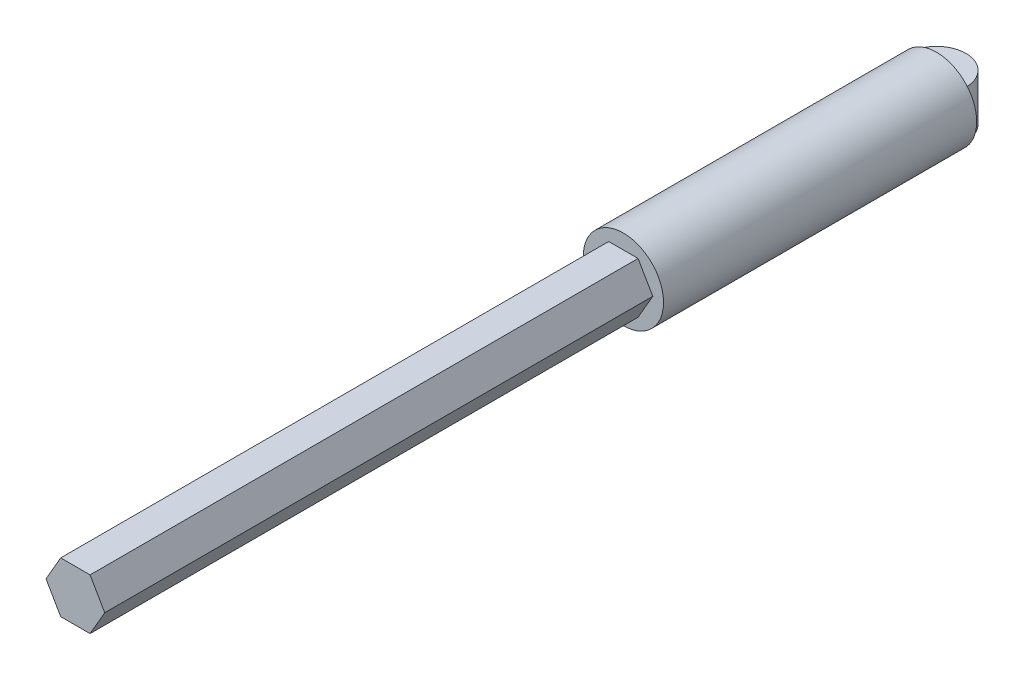
ISO-10303-21;
HEADER;
FILE_DESCRIPTION(('STEP AP214'),'2;1');
FILE_NAME('part.step','',(''),(''),'','','');
FILE_SCHEMA(('AUTOMOTIVE_DESIGN { 1 0 10303 214 1 1 1 1 }'));
ENDSEC;
DATA;
#1=APPLICATION_CONTEXT('core data for automotive mechanical design processes');
#2=APPLICATION_PROTOCOL_DEFINITION('international standard','automotive_design',2000,#1);
#3=PRODUCT_CONTEXT('',#1,'mechanical');
#4=PRODUCT('Part','Part','',(#3));
#5=PRODUCT_RELATED_PRODUCT_CATEGORY('part','',(#4));
#6=PRODUCT_DEFINITION_FORMATION('','',#4);
#7=PRODUCT_DEFINITION_CONTEXT('part definition',#1,'design');
#8=PRODUCT_DEFINITION('design','',#6,#7);
#9=PRODUCT_DEFINITION_SHAPE('','',#8);
#10=(LENGTH_UNIT() NAMED_UNIT(*) SI_UNIT(.MILLI.,.METRE.));
#11=(NAMED_UNIT(*) PLANE_ANGLE_UNIT() SI_UNIT($,.RADIAN.));
#12=(NAMED_UNIT(*) SI_UNIT($,.STERADIAN.) SOLID_ANGLE_UNIT());
#13=UNCERTAINTY_MEASURE_WITH_UNIT(LENGTH_MEASURE(1.E-05),#10,'distance_accuracy_value','');
#14=(GEOMETRIC_REPRESENTATION_CONTEXT(3) GLOBAL_UNCERTAINTY_ASSIGNED_CONTEXT((#13)) GLOBAL_UNIT_ASSIGNED_CONTEXT((#10,
#11,#12)) REPRESENTATION_CONTEXT('',''));
#15=CARTESIAN_POINT('',(0.,0.,0.));
#16=DIRECTION('',(0.,0.,1.));
#17=DIRECTION('',(1.,0.,0.));
#18=AXIS2_PLACEMENT_3D('',#15,#16,#17);
#19=CARTESIAN_POINT('',(0.,0.,0.));
#20=DIRECTION('',(0.,0.,1.));
#21=DIRECTION('',(1.,0.,0.));
#22=AXIS2_PLACEMENT_3D('',#19,#20,#21);
#23=PLANE('',#22);
#24=CARTESIAN_POINT('',(0.,0.,0.));
#25=DIRECTION('',(0.,0.,1.));
#26=DIRECTION('',(1.,0.,0.));
#27=AXIS2_PLACEMENT_3D('',#24,#25,#26);
#28=CIRCLE('',#27,1.025);
#29=CARTESIAN_POINT('',(1.025,0.,0.));
#30=VERTEX_POINT('',#29);
#31=EDGE_CURVE('E54',#30,#30,#28,.T.);
#32=ORIENTED_EDGE('',*,*,#31,.F.);
#33=EDGE_LOOP('',(#32));
#34=FACE_BOUND('',#33,.T.);
#35=DIRECTION('',(-1.,0.,0.));
#36=VECTOR('',#35,1.);
#37=CARTESIAN_POINT('',(0.,-0.575,0.));
#38=LINE('',#37,#36);
#39=CARTESIAN_POINT('',(0.75,-0.575,0.));
#40=VERTEX_POINT('',#39);
#41=CARTESIAN_POINT('',(-0.75,-0.575,0.));
#42=VERTEX_POINT('',#41);
#43=EDGE_CURVE('E120',#40,#42,#38,.T.);
#44=ORIENTED_EDGE('',*,*,#43,.F.);
#45=DIRECTION('',(0.,1.,0.));
#46=VECTOR('',#45,1.);
#47=CARTESIAN_POINT('',(0.75,-0.2,0.));
#48=LINE('',#47,#46);
#49=CARTESIAN_POINT('',(0.75,0.625,0.));
#50=VERTEX_POINT('',#49);
#51=EDGE_CURVE('E205',#40,#50,#48,.T.);
#52=ORIENTED_EDGE('',*,*,#51,.T.);
#53=DIRECTION('',(1.,0.,0.));
#54=VECTOR('',#53,1.);
#55=CARTESIAN_POINT('',(0.,0.625,0.));
#56=LINE('',#55,#54);
#57=CARTESIAN_POINT('',(-0.75,0.625,0.));
#58=VERTEX_POINT('',#57);
#59=EDGE_CURVE('E197',#58,#50,#56,.T.);
#60=ORIENTED_EDGE('',*,*,#59,.F.);
#61=DIRECTION('',(0.,1.,0.));
#62=VECTOR('',#61,1.);
#63=CARTESIAN_POINT('',(-0.75,-0.2,0.));
#64=LINE('',#63,#62);
#65=EDGE_CURVE('E68',#42,#58,#64,.T.);
#66=ORIENTED_EDGE('',*,*,#65,.F.);
#67=EDGE_LOOP('',(#44,#52,#60,#66));
#68=FACE_BOUND('',#67,.T.);
#69=ADVANCED_FACE('F45',(#34,#68),#23,.F.);
#70=CARTESIAN_POINT('',(0.,0.,5.));
#71=DIRECTION('',(0.,0.,-1.));
#72=DIRECTION('',(-1.,0.,0.));
#73=AXIS2_PLACEMENT_3D('',#70,#71,#72);
#74=CYLINDRICAL_SURFACE('',#73,1.025);
#75=ORIENTED_EDGE('',*,*,#31,.T.);
#76=EDGE_LOOP('',(#75));
#77=FACE_BOUND('',#76,.T.);
#78=CARTESIAN_POINT('',(0.,0.,8.));
#79=DIRECTION('',(0.,0.,1.));
#80=DIRECTION('',(1.,0.,0.));
#81=AXIS2_PLACEMENT_3D('',#78,#79,#80);
#82=CIRCLE('',#81,1.025);
#83=CARTESIAN_POINT('',(1.025,0.,8.));
#84=VERTEX_POINT('',#83);
#85=EDGE_CURVE('E152',#84,#84,#82,.T.);
#86=ORIENTED_EDGE('',*,*,#85,.F.);
#87=EDGE_LOOP('',(#86));
#88=FACE_BOUND('',#87,.T.);
#89=ADVANCED_FACE('F47',(#77,#88),#74,.T.);
#90=CARTESIAN_POINT('',(0.,-0.2,0.));
#91=DIRECTION('',(0.,1.,0.));
#92=DIRECTION('',(0.,0.,1.));
#93=AXIS2_PLACEMENT_3D('',#90,#91,#92);
#94=CYLINDRICAL_SURFACE('',#93,0.75);
#95=ORIENTED_EDGE('',*,*,#65,.T.);
#96=CARTESIAN_POINT('',(0.,0.625,0.));
#97=DIRECTION('',(0.,1.,0.));
#98=DIRECTION('',(0.,0.,1.));
#99=AXIS2_PLACEMENT_3D('',#96,#97,#98);
#100=CIRCLE('',#99,0.75);
#101=EDGE_CURVE('E201',#50,#58,#100,.T.);
#102=ORIENTED_EDGE('',*,*,#101,.F.);
#103=ORIENTED_EDGE('',*,*,#51,.F.);
#104=CARTESIAN_POINT('',(0.,-0.575,0.));
#105=DIRECTION('',(0.,-1.,0.));
#106=DIRECTION('',(0.,0.,-1.));
#107=AXIS2_PLACEMENT_3D('',#104,#105,#106);
#108=CIRCLE('',#107,0.75);
#109=EDGE_CURVE('E193',#42,#40,#108,.T.);
#110=ORIENTED_EDGE('',*,*,#109,.F.);
#111=EDGE_LOOP('',(#95,#102,#103,#110));
#112=FACE_BOUND('',#111,.T.);
#113=ADVANCED_FACE('F220',(#112),#94,.T.);
#114=CARTESIAN_POINT('',(0.,0.625,0.));
#115=DIRECTION('',(0.,1.,0.));
#116=DIRECTION('',(0.,0.,1.));
#117=AXIS2_PLACEMENT_3D('',#114,#115,#116);
#118=PLANE('',#117);
#119=ORIENTED_EDGE('',*,*,#59,.T.);
#120=ORIENTED_EDGE('',*,*,#101,.T.);
#121=EDGE_LOOP('',(#119,#120));
#122=FACE_BOUND('',#121,.T.);
#123=ADVANCED_FACE('F222',(#122),#118,.T.);
#124=CARTESIAN_POINT('',(0.,-0.575,0.));
#125=DIRECTION('',(0.,-1.,0.));
#126=DIRECTION('',(0.,0.,-1.));
#127=AXIS2_PLACEMENT_3D('',#124,#125,#126);
#128=PLANE('',#127);
#129=ORIENTED_EDGE('',*,*,#43,.T.);
#130=ORIENTED_EDGE('',*,*,#109,.T.);
#131=EDGE_LOOP('',(#129,#130));
#132=FACE_BOUND('',#131,.T.);
#133=ADVANCED_FACE('F219',(#132),#128,.T.);
#134=CARTESIAN_POINT('',(0.,0.,8.));
#135=DIRECTION('',(0.,0.,1.));
#136=DIRECTION('',(1.,0.,0.));
#137=AXIS2_PLACEMENT_3D('',#134,#135,#136);
#138=PLANE('',#137);
#139=ORIENTED_EDGE('',*,*,#85,.T.);
#140=EDGE_LOOP('',(#139));
#141=FACE_BOUND('',#140,.T.);
#142=DIRECTION('',(0.5,0.866025403784439,0.));
#143=VECTOR('',#142,1.);
#144=CARTESIAN_POINT('',(0.562916512459886,-0.325,8.));
#145=LINE('',#144,#143);
#146=CARTESIAN_POINT('',(0.375277674973257,-0.650000000000001,8.));
#147=VERTEX_POINT('',#146);
#148=CARTESIAN_POINT('',(0.750555349946514,0.,8.));
#149=VERTEX_POINT('',#148);
#150=EDGE_CURVE('E61',#147,#149,#145,.T.);
#151=ORIENTED_EDGE('',*,*,#150,.F.);
#152=DIRECTION('',(1.,0.,0.));
#153=VECTOR('',#152,1.);
#154=CARTESIAN_POINT('',(0.,-0.650000000000001,8.));
#155=LINE('',#154,#153);
#156=CARTESIAN_POINT('',(-0.375277674973257,-0.650000000000001,8.));
#157=VERTEX_POINT('',#156);
#158=EDGE_CURVE('E11',#157,#147,#155,.T.);
#159=ORIENTED_EDGE('',*,*,#158,.F.);
#160=DIRECTION('',(0.5,-0.866025403784439,0.));
#161=VECTOR('',#160,1.);
#162=CARTESIAN_POINT('',(-0.562916512459886,-0.325,8.));
#163=LINE('',#162,#161);
#164=CARTESIAN_POINT('',(-0.750555349946514,0.,8.));
#165=VERTEX_POINT('',#164);
#166=EDGE_CURVE('E156',#165,#157,#163,.T.);
#167=ORIENTED_EDGE('',*,*,#166,.F.);
#168=DIRECTION('',(-0.5,-0.866025403784439,0.));
#169=VECTOR('',#168,1.);
#170=CARTESIAN_POINT('',(-0.562916512459886,0.325,8.));
#171=LINE('',#170,#169);
#172=CARTESIAN_POINT('',(-0.375277674973257,0.650000000000001,8.));
#173=VERTEX_POINT('',#172);
#174=EDGE_CURVE('E160',#173,#165,#171,.T.);
#175=ORIENTED_EDGE('',*,*,#174,.F.);
#176=DIRECTION('',(-1.,0.,0.));
#177=VECTOR('',#176,1.);
#178=CARTESIAN_POINT('',(0.,0.650000000000001,8.));
#179=LINE('',#178,#177);
#180=CARTESIAN_POINT('',(0.375277674973257,0.650000000000001,8.));
#181=VERTEX_POINT('',#180);
#182=EDGE_CURVE('E164',#181,#173,#179,.T.);
#183=ORIENTED_EDGE('',*,*,#182,.F.);
#184=DIRECTION('',(-0.5,0.866025403784439,0.));
#185=VECTOR('',#184,1.);
#186=CARTESIAN_POINT('',(0.562916512459885,0.325,8.));
#187=LINE('',#186,#185);
#188=EDGE_CURVE('E168',#149,#181,#187,.T.);
#189=ORIENTED_EDGE('',*,*,#188,.F.);
#190=EDGE_LOOP('',(#151,#159,#167,#175,#183,#189));
#191=FACE_BOUND('',#190,.T.);
#192=ADVANCED_FACE('F229',(#141,#191),#138,.T.);
#193=CARTESIAN_POINT('',(0.,-0.650000000000001,19.));
#194=DIRECTION('',(0.,1.,0.));
#195=DIRECTION('',(0.,0.,1.));
#196=AXIS2_PLACEMENT_3D('',#193,#194,#195);
#197=PLANE('',#196);
#198=DIRECTION('',(0.,0.,-1.));
#199=VECTOR('',#198,1.);
#200=CARTESIAN_POINT('',(-0.375277674973257,-0.650000000000001,19.));
#201=LINE('',#200,#199);
#202=CARTESIAN_POINT('',(-0.375277674973251,-0.650000000000004,22.));
#203=VERTEX_POINT('',#202);
#204=EDGE_CURVE('E176',#203,#157,#201,.T.);
#205=ORIENTED_EDGE('',*,*,#204,.T.);
#206=ORIENTED_EDGE('',*,*,#158,.T.);
#207=DIRECTION('',(0.,0.,-1.));
#208=VECTOR('',#207,1.);
#209=CARTESIAN_POINT('',(0.375277674973257,-0.650000000000001,19.));
#210=LINE('',#209,#208);
#211=CARTESIAN_POINT('',(0.375277674973264,-0.649999999999996,22.));
#212=VERTEX_POINT('',#211);
#213=EDGE_CURVE('E173',#212,#147,#210,.T.);
#214=ORIENTED_EDGE('',*,*,#213,.F.);
#215=DIRECTION('',(1.,0.,0.));
#216=VECTOR('',#215,1.);
#217=CARTESIAN_POINT('',(-0.375277674973251,-0.650000000000004,22.));
#218=LINE('',#217,#216);
#219=EDGE_CURVE('E137',#203,#212,#218,.T.);
#220=ORIENTED_EDGE('',*,*,#219,.F.);
#221=EDGE_LOOP('',(#205,#206,#214,#220));
#222=FACE_BOUND('',#221,.T.);
#223=ADVANCED_FACE('F248',(#222),#197,.F.);
#224=CARTESIAN_POINT('',(-0.562916512459886,-0.325,19.));
#225=DIRECTION('',(0.866025403784439,0.5,0.));
#226=DIRECTION('',(-0.5,0.866025403784439,0.));
#227=AXIS2_PLACEMENT_3D('',#224,#225,#226);
#228=PLANE('',#227);
#229=DIRECTION('',(0.,0.,-1.));
#230=VECTOR('',#229,1.);
#231=CARTESIAN_POINT('',(-0.750555349946514,0.,19.));
#232=LINE('',#231,#230);
#233=CARTESIAN_POINT('',(-0.750555349946514,0.,22.));
#234=VERTEX_POINT('',#233);
#235=EDGE_CURVE('E180',#234,#165,#232,.T.);
#236=ORIENTED_EDGE('',*,*,#235,.T.);
#237=ORIENTED_EDGE('',*,*,#166,.T.);
#238=ORIENTED_EDGE('',*,*,#204,.F.);
#239=DIRECTION('',(0.500000000000007,-0.866025403784435,0.));
#240=VECTOR('',#239,1.);
#241=CARTESIAN_POINT('',(-0.750555349946514,0.,22.));
#242=LINE('',#241,#240);
#243=EDGE_CURVE('E147',#234,#203,#242,.T.);
#244=ORIENTED_EDGE('',*,*,#243,.F.);
#245=EDGE_LOOP('',(#236,#237,#238,#244));
#246=FACE_BOUND('',#245,.T.);
#247=ADVANCED_FACE('F244',(#246),#228,.F.);
#248=CARTESIAN_POINT('',(-0.562916512459886,0.325,19.));
#249=DIRECTION('',(0.866025403784439,-0.5,0.));
#250=DIRECTION('',(0.5,0.866025403784439,0.));
#251=AXIS2_PLACEMENT_3D('',#248,#249,#250);
#252=PLANE('',#251);
#253=DIRECTION('',(0.,0.,-1.));
#254=VECTOR('',#253,1.);
#255=CARTESIAN_POINT('',(-0.375277674973257,0.650000000000001,19.));
#256=LINE('',#255,#254);
#257=CARTESIAN_POINT('',(-0.37527767497326,0.649999999999999,22.));
#258=VERTEX_POINT('',#257);
#259=EDGE_CURVE('E184',#258,#173,#256,.T.);
#260=ORIENTED_EDGE('',*,*,#259,.T.);
#261=ORIENTED_EDGE('',*,*,#174,.T.);
#262=ORIENTED_EDGE('',*,*,#235,.F.);
#263=DIRECTION('',(-0.499999999999995,-0.866025403784441,0.));
#264=VECTOR('',#263,1.);
#265=CARTESIAN_POINT('',(-0.37527767497326,0.649999999999999,22.));
#266=LINE('',#265,#264);
#267=EDGE_CURVE('E143',#258,#234,#266,.T.);
#268=ORIENTED_EDGE('',*,*,#267,.F.);
#269=EDGE_LOOP('',(#260,#261,#262,#268));
#270=FACE_BOUND('',#269,.T.);
#271=ADVANCED_FACE('F240',(#270),#252,.F.);
#272=CARTESIAN_POINT('',(0.,0.650000000000001,19.));
#273=DIRECTION('',(0.,-1.,0.));
#274=DIRECTION('',(1.,0.,0.));
#275=AXIS2_PLACEMENT_3D('',#272,#273,#274);
#276=PLANE('',#275);
#277=DIRECTION('',(0.,0.,-1.));
#278=VECTOR('',#277,1.);
#279=CARTESIAN_POINT('',(0.375277674973257,0.650000000000001,19.));
#280=LINE('',#279,#278);
#281=CARTESIAN_POINT('',(0.375277674973256,0.650000000000001,22.));
#282=VERTEX_POINT('',#281);
#283=EDGE_CURVE('E121',#282,#181,#280,.T.);
#284=ORIENTED_EDGE('',*,*,#283,.T.);
#285=ORIENTED_EDGE('',*,*,#182,.T.);
#286=ORIENTED_EDGE('',*,*,#259,.F.);
#287=DIRECTION('',(-1.,0.,0.));
#288=VECTOR('',#287,1.);
#289=CARTESIAN_POINT('',(0.375277674973256,0.650000000000001,22.));
#290=LINE('',#289,#288);
#291=EDGE_CURVE('E131',#282,#258,#290,.T.);
#292=ORIENTED_EDGE('',*,*,#291,.F.);
#293=EDGE_LOOP('',(#284,#285,#286,#292));
#294=FACE_BOUND('',#293,.T.);
#295=ADVANCED_FACE('F237',(#294),#276,.F.);
#296=CARTESIAN_POINT('',(0.562916512459885,0.325,19.));
#297=DIRECTION('',(-0.866025403784439,-0.5,0.));
#298=DIRECTION('',(0.5,-0.866025403784439,0.));
#299=AXIS2_PLACEMENT_3D('',#296,#297,#298);
#300=PLANE('',#299);
#301=DIRECTION('',(0.,0.,-1.));
#302=VECTOR('',#301,1.);
#303=CARTESIAN_POINT('',(0.750555349946514,0.,19.));
#304=LINE('',#303,#302);
#305=CARTESIAN_POINT('',(0.750555349946514,0.,22.));
#306=VERTEX_POINT('',#305);
#307=EDGE_CURVE('E111',#306,#149,#304,.T.);
#308=ORIENTED_EDGE('',*,*,#307,.T.);
#309=ORIENTED_EDGE('',*,*,#188,.T.);
#310=ORIENTED_EDGE('',*,*,#283,.F.);
#311=DIRECTION('',(-0.500000000000001,0.866025403784438,0.));
#312=VECTOR('',#311,1.);
#313=CARTESIAN_POINT('',(0.750555349946514,0.,22.));
#314=LINE('',#313,#312);
#315=EDGE_CURVE('E124',#306,#282,#314,.T.);
#316=ORIENTED_EDGE('',*,*,#315,.F.);
#317=EDGE_LOOP('',(#308,#309,#310,#316));
#318=FACE_BOUND('',#317,.T.);
#319=ADVANCED_FACE('F125',(#318),#300,.F.);
#320=CARTESIAN_POINT('',(0.562916512459886,-0.325,19.));
#321=DIRECTION('',(-0.866025403784439,0.5,0.));
#322=DIRECTION('',(-0.5,-0.866025403784439,0.));
#323=AXIS2_PLACEMENT_3D('',#320,#321,#322);
#324=PLANE('',#323);
#325=ORIENTED_EDGE('',*,*,#213,.T.);
#326=ORIENTED_EDGE('',*,*,#150,.T.);
#327=ORIENTED_EDGE('',*,*,#307,.F.);
#328=DIRECTION('',(0.499999999999995,0.866025403784441,0.));
#329=VECTOR('',#328,1.);
#330=CARTESIAN_POINT('',(0.375277674973264,-0.649999999999996,22.));
#331=LINE('',#330,#329);
#332=EDGE_CURVE('E116',#212,#306,#331,.T.);
#333=ORIENTED_EDGE('',*,*,#332,.F.);
#334=EDGE_LOOP('',(#325,#326,#327,#333));
#335=FACE_BOUND('',#334,.T.);
#336=ADVANCED_FACE('F114',(#335),#324,.F.);
#337=CARTESIAN_POINT('',(0.,0.,22.));
#338=DIRECTION('',(0.,0.,1.));
#339=DIRECTION('',(1.,0.,0.));
#340=AXIS2_PLACEMENT_3D('',#337,#338,#339);
#341=PLANE('',#340);
#342=ORIENTED_EDGE('',*,*,#332,.T.);
#343=ORIENTED_EDGE('',*,*,#315,.T.);
#344=ORIENTED_EDGE('',*,*,#291,.T.);
#345=ORIENTED_EDGE('',*,*,#267,.T.);
#346=ORIENTED_EDGE('',*,*,#243,.T.);
#347=ORIENTED_EDGE('',*,*,#219,.T.);
#348=EDGE_LOOP('',(#342,#343,#344,#345,#346,#347));
#349=FACE_BOUND('',#348,.T.);
#350=ADVANCED_FACE('F134',(#349),#341,.T.);
#351=CLOSED_SHELL('',(#69,#89,#113,#123,#133,#192,#223,#247,#271,#295,#319,#336,#350));
#352=MANIFOLD_SOLID_BREP('B2',#351);
#353=ADVANCED_BREP_SHAPE_REPRESENTATION('',(#18,#352),#14);
#354=SHAPE_DEFINITION_REPRESENTATION(#9,#353);
ENDSEC;
END-ISO-10303-21;
